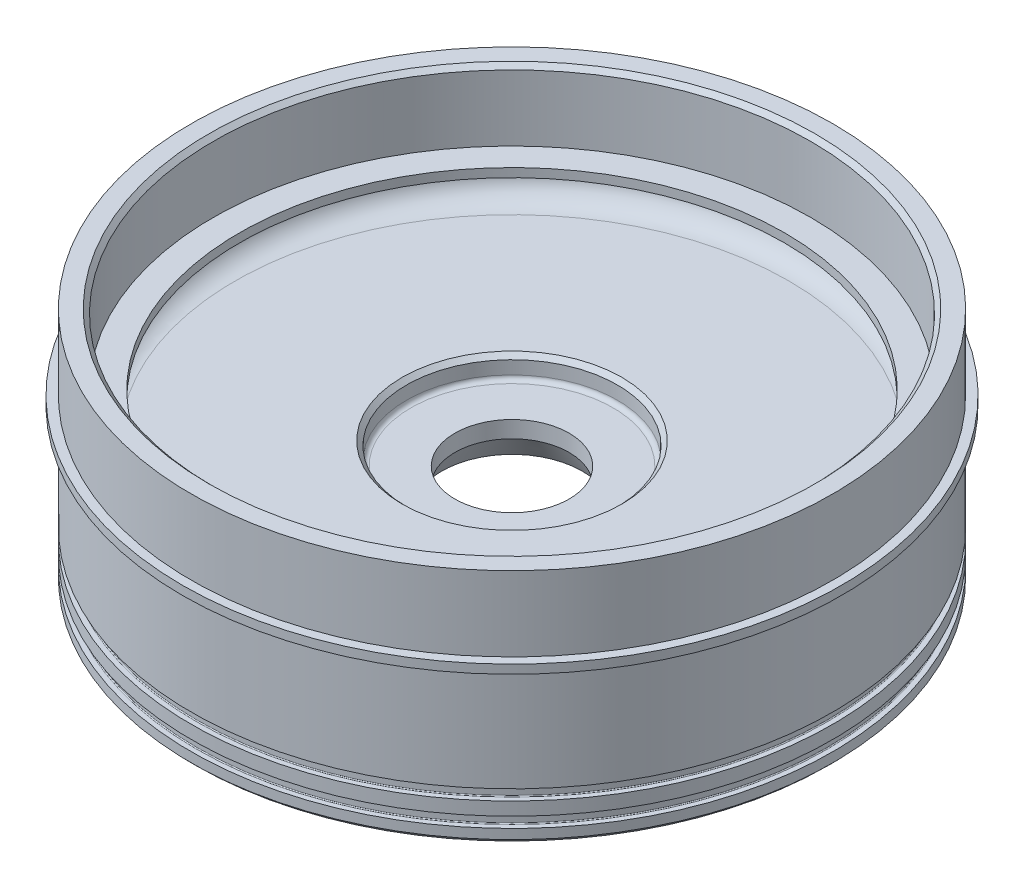
ISO-10303-21;
HEADER;
FILE_DESCRIPTION(('STEP AP214'),'2;1');
FILE_NAME('part.step','',(''),(''),'','','');
FILE_SCHEMA(('AUTOMOTIVE_DESIGN { 1 0 10303 214 1 1 1 1 }'));
ENDSEC;
DATA;
#1=APPLICATION_CONTEXT('core data for automotive mechanical design processes');
#2=APPLICATION_PROTOCOL_DEFINITION('international standard','automotive_design',2000,#1);
#3=PRODUCT_CONTEXT('',#1,'mechanical');
#4=PRODUCT('Part','Part','',(#3));
#5=PRODUCT_RELATED_PRODUCT_CATEGORY('part','',(#4));
#6=PRODUCT_DEFINITION_FORMATION('','',#4);
#7=PRODUCT_DEFINITION_CONTEXT('part definition',#1,'design');
#8=PRODUCT_DEFINITION('design','',#6,#7);
#9=PRODUCT_DEFINITION_SHAPE('','',#8);
#10=(LENGTH_UNIT() NAMED_UNIT(*) SI_UNIT(.MILLI.,.METRE.));
#11=(NAMED_UNIT(*) PLANE_ANGLE_UNIT() SI_UNIT($,.RADIAN.));
#12=(NAMED_UNIT(*) SI_UNIT($,.STERADIAN.) SOLID_ANGLE_UNIT());
#13=UNCERTAINTY_MEASURE_WITH_UNIT(LENGTH_MEASURE(1.E-05),#10,'distance_accuracy_value','');
#14=(GEOMETRIC_REPRESENTATION_CONTEXT(3) GLOBAL_UNCERTAINTY_ASSIGNED_CONTEXT((#13)) GLOBAL_UNIT_ASSIGNED_CONTEXT((#10,
#11,#12)) REPRESENTATION_CONTEXT('',''));
#15=CARTESIAN_POINT('',(0.,0.,0.));
#16=DIRECTION('',(0.,0.,1.));
#17=DIRECTION('',(1.,0.,0.));
#18=AXIS2_PLACEMENT_3D('',#15,#16,#17);
#19=CARTESIAN_POINT('',(0.,0.,0.));
#20=DIRECTION('',(0.,-1.,0.));
#21=DIRECTION('',(0.,0.,-1.));
#22=AXIS2_PLACEMENT_3D('',#19,#20,#21);
#23=CYLINDRICAL_SURFACE('',#22,13.);
#24=CARTESIAN_POINT('',(0.,5.19615242270666,0.));
#25=DIRECTION('',(0.,-1.,0.));
#26=DIRECTION('',(0.,0.,-1.));
#27=AXIS2_PLACEMENT_3D('',#24,#25,#26);
#28=CIRCLE('',#27,13.);
#29=CARTESIAN_POINT('',(0.,5.19615242270666,-13.));
#30=VERTEX_POINT('',#29);
#31=EDGE_CURVE('E112',#30,#30,#28,.T.);
#32=ORIENTED_EDGE('',*,*,#31,.T.);
#33=EDGE_LOOP('',(#32));
#34=FACE_BOUND('',#33,.T.);
#35=CARTESIAN_POINT('',(0.,8.99999999999999,0.));
#36=DIRECTION('',(0.,-1.,0.));
#37=DIRECTION('',(0.,0.,-1.));
#38=AXIS2_PLACEMENT_3D('',#35,#36,#37);
#39=CIRCLE('',#38,13.);
#40=CARTESIAN_POINT('',(0.,8.99999999999999,-13.));
#41=VERTEX_POINT('',#40);
#42=EDGE_CURVE('E154',#41,#41,#39,.T.);
#43=ORIENTED_EDGE('',*,*,#42,.F.);
#44=EDGE_LOOP('',(#43));
#45=FACE_BOUND('',#44,.T.);
#46=ADVANCED_FACE('F37',(#34,#45),#23,.F.);
#47=CARTESIAN_POINT('',(0.,14.,0.));
#48=DIRECTION('',(0.,1.,0.));
#49=DIRECTION('',(0.,0.,1.));
#50=AXIS2_PLACEMENT_3D('',#47,#48,#49);
#51=PLANE('',#50);
#52=CARTESIAN_POINT('',(0.,14.,0.));
#53=DIRECTION('',(0.,1.,0.));
#54=DIRECTION('',(0.,0.,1.));
#55=AXIS2_PLACEMENT_3D('',#52,#53,#54);
#56=CIRCLE('',#55,63.);
#57=CARTESIAN_POINT('',(0.,14.,63.));
#58=VERTEX_POINT('',#57);
#59=EDGE_CURVE('E49',#58,#58,#56,.T.);
#60=ORIENTED_EDGE('',*,*,#59,.T.);
#61=EDGE_LOOP('',(#60));
#62=FACE_BOUND('',#61,.T.);
#63=CARTESIAN_POINT('',(0.,14.,0.));
#64=DIRECTION('',(0.,1.,0.));
#65=DIRECTION('',(0.,0.,1.));
#66=AXIS2_PLACEMENT_3D('',#63,#64,#65);
#67=CIRCLE('',#66,25.);
#68=CARTESIAN_POINT('',(0.,14.,25.));
#69=VERTEX_POINT('',#68);
#70=EDGE_CURVE('E61',#69,#69,#67,.F.);
#71=ORIENTED_EDGE('',*,*,#70,.T.);
#72=EDGE_LOOP('',(#71));
#73=FACE_BOUND('',#72,.T.);
#74=ADVANCED_FACE('F161',(#62,#73),#51,.T.);
#75=CARTESIAN_POINT('',(0.,0.,0.));
#76=DIRECTION('',(0.,-1.,0.));
#77=DIRECTION('',(0.,0.,-1.));
#78=AXIS2_PLACEMENT_3D('',#75,#76,#77);
#79=CYLINDRICAL_SURFACE('',#78,68.);
#80=CARTESIAN_POINT('',(0.,19.,0.));
#81=DIRECTION('',(0.,1.,0.));
#82=DIRECTION('',(0.,0.,1.));
#83=AXIS2_PLACEMENT_3D('',#80,#81,#82);
#84=CIRCLE('',#83,68.);
#85=CARTESIAN_POINT('',(0.,19.,68.));
#86=VERTEX_POINT('',#85);
#87=EDGE_CURVE('E53',#86,#86,#84,.F.);
#88=ORIENTED_EDGE('',*,*,#87,.T.);
#89=EDGE_LOOP('',(#88));
#90=FACE_BOUND('',#89,.T.);
#91=CARTESIAN_POINT('',(0.,22.,0.));
#92=DIRECTION('',(0.,-1.,0.));
#93=DIRECTION('',(0.,0.,-1.));
#94=AXIS2_PLACEMENT_3D('',#91,#92,#93);
#95=CIRCLE('',#94,68.);
#96=CARTESIAN_POINT('',(0.,22.,-68.));
#97=VERTEX_POINT('',#96);
#98=EDGE_CURVE('E115',#97,#97,#95,.T.);
#99=ORIENTED_EDGE('',*,*,#98,.F.);
#100=EDGE_LOOP('',(#99));
#101=FACE_BOUND('',#100,.T.);
#102=ADVANCED_FACE('F167',(#90,#101),#79,.F.);
#103=CARTESIAN_POINT('',(0.,22.,0.));
#104=DIRECTION('',(0.,-1.,0.));
#105=DIRECTION('',(0.,0.,-1.));
#106=AXIS2_PLACEMENT_3D('',#103,#104,#105);
#107=PLANE('',#106);
#108=ORIENTED_EDGE('',*,*,#98,.T.);
#109=EDGE_LOOP('',(#108));
#110=FACE_BOUND('',#109,.T.);
#111=CARTESIAN_POINT('',(0.,22.,0.));
#112=DIRECTION('',(0.,-1.,0.));
#113=DIRECTION('',(0.,0.,-1.));
#114=AXIS2_PLACEMENT_3D('',#111,#112,#113);
#115=CIRCLE('',#114,62.);
#116=CARTESIAN_POINT('',(0.,22.,-62.));
#117=VERTEX_POINT('',#116);
#118=EDGE_CURVE('E118',#117,#117,#115,.T.);
#119=ORIENTED_EDGE('',*,*,#118,.F.);
#120=EDGE_LOOP('',(#119));
#121=FACE_BOUND('',#120,.T.);
#122=ADVANCED_FACE('F238',(#110,#121),#107,.T.);
#123=CARTESIAN_POINT('',(0.,0.,0.));
#124=DIRECTION('',(0.,-1.,0.));
#125=DIRECTION('',(0.,0.,-1.));
#126=AXIS2_PLACEMENT_3D('',#123,#124,#125);
#127=CYLINDRICAL_SURFACE('',#126,62.);
#128=ORIENTED_EDGE('',*,*,#118,.T.);
#129=EDGE_LOOP('',(#128));
#130=FACE_BOUND('',#129,.T.);
#131=CARTESIAN_POINT('',(0.,24.,0.));
#132=DIRECTION('',(0.,-1.,0.));
#133=DIRECTION('',(0.,0.,-1.));
#134=AXIS2_PLACEMENT_3D('',#131,#132,#133);
#135=CIRCLE('',#134,62.);
#136=CARTESIAN_POINT('',(0.,24.,-62.));
#137=VERTEX_POINT('',#136);
#138=EDGE_CURVE('E121',#137,#137,#135,.T.);
#139=ORIENTED_EDGE('',*,*,#138,.F.);
#140=EDGE_LOOP('',(#139));
#141=FACE_BOUND('',#140,.T.);
#142=ADVANCED_FACE('F245',(#130,#141),#127,.F.);
#143=CARTESIAN_POINT('',(0.,24.,0.));
#144=DIRECTION('',(0.,1.,0.));
#145=DIRECTION('',(0.,0.,1.));
#146=AXIS2_PLACEMENT_3D('',#143,#144,#145);
#147=PLANE('',#146);
#148=ORIENTED_EDGE('',*,*,#138,.T.);
#149=EDGE_LOOP('',(#148));
#150=FACE_BOUND('',#149,.T.);
#151=CARTESIAN_POINT('',(0.,24.,0.));
#152=DIRECTION('',(0.,-1.,0.));
#153=DIRECTION('',(0.,0.,-1.));
#154=AXIS2_PLACEMENT_3D('',#151,#152,#153);
#155=CIRCLE('',#154,68.);
#156=CARTESIAN_POINT('',(0.,24.,-68.));
#157=VERTEX_POINT('',#156);
#158=EDGE_CURVE('E124',#157,#157,#155,.T.);
#159=ORIENTED_EDGE('',*,*,#158,.F.);
#160=EDGE_LOOP('',(#159));
#161=FACE_BOUND('',#160,.T.);
#162=ADVANCED_FACE('F250',(#150,#161),#147,.T.);
#163=CARTESIAN_POINT('',(0.,39.,0.));
#164=DIRECTION('',(0.,1.,0.));
#165=DIRECTION('',(0.,0.,1.));
#166=AXIS2_PLACEMENT_3D('',#163,#164,#165);
#167=CIRCLE('',#166,68.);
#168=CARTESIAN_POINT('',(0.,39.,68.));
#169=VERTEX_POINT('',#168);
#170=EDGE_CURVE('E94',#169,#169,#167,.T.);
#171=ORIENTED_EDGE('',*,*,#170,.T.);
#172=EDGE_LOOP('',(#171));
#173=FACE_BOUND('',#172,.T.);
#174=ORIENTED_EDGE('',*,*,#158,.T.);
#175=EDGE_LOOP('',(#174));
#176=FACE_BOUND('',#175,.T.);
#177=ADVANCED_FACE('F240',(#173,#176),#79,.F.);
#178=CARTESIAN_POINT('',(0.,40.,0.));
#179=DIRECTION('',(0.,1.,0.));
#180=DIRECTION('',(0.,0.,1.));
#181=AXIS2_PLACEMENT_3D('',#178,#179,#180);
#182=PLANE('',#181);
#183=CARTESIAN_POINT('',(0.,40.,0.));
#184=DIRECTION('',(0.,1.,0.));
#185=DIRECTION('',(0.,0.,1.));
#186=AXIS2_PLACEMENT_3D('',#183,#184,#185);
#187=CIRCLE('',#186,69.);
#188=CARTESIAN_POINT('',(0.,40.,69.));
#189=VERTEX_POINT('',#188);
#190=EDGE_CURVE('E97',#189,#189,#187,.F.);
#191=ORIENTED_EDGE('',*,*,#190,.T.);
#192=EDGE_LOOP('',(#191));
#193=FACE_BOUND('',#192,.T.);
#194=CARTESIAN_POINT('',(0.,40.,0.));
#195=DIRECTION('',(0.,-1.,0.));
#196=DIRECTION('',(0.,0.,-1.));
#197=AXIS2_PLACEMENT_3D('',#194,#195,#196);
#198=CIRCLE('',#197,73.);
#199=CARTESIAN_POINT('',(0.,40.,-73.));
#200=VERTEX_POINT('',#199);
#201=EDGE_CURVE('E127',#200,#200,#198,.T.);
#202=ORIENTED_EDGE('',*,*,#201,.F.);
#203=EDGE_LOOP('',(#202));
#204=FACE_BOUND('',#203,.T.);
#205=ADVANCED_FACE('F260',(#193,#204),#182,.T.);
#206=CARTESIAN_POINT('',(0.,0.,0.));
#207=DIRECTION('',(0.,-1.,0.));
#208=DIRECTION('',(0.,0.,-1.));
#209=AXIS2_PLACEMENT_3D('',#206,#207,#208);
#210=CYLINDRICAL_SURFACE('',#209,73.);
#211=ORIENTED_EDGE('',*,*,#201,.T.);
#212=EDGE_LOOP('',(#211));
#213=FACE_BOUND('',#212,.T.);
#214=CARTESIAN_POINT('',(0.,23.,0.));
#215=DIRECTION('',(0.,-1.,0.));
#216=DIRECTION('',(0.,0.,-1.));
#217=AXIS2_PLACEMENT_3D('',#214,#215,#216);
#218=CIRCLE('',#217,73.);
#219=CARTESIAN_POINT('',(0.,23.,-73.));
#220=VERTEX_POINT('',#219);
#221=EDGE_CURVE('E130',#220,#220,#218,.T.);
#222=ORIENTED_EDGE('',*,*,#221,.F.);
#223=EDGE_LOOP('',(#222));
#224=FACE_BOUND('',#223,.T.);
#225=ADVANCED_FACE('F265',(#213,#224),#210,.T.);
#226=CARTESIAN_POINT('',(0.,23.,0.));
#227=DIRECTION('',(0.,-1.,0.));
#228=DIRECTION('',(0.,0.,-1.));
#229=AXIS2_PLACEMENT_3D('',#226,#227,#228);
#230=PLANE('',#229);
#231=CARTESIAN_POINT('',(0.,23.,0.));
#232=DIRECTION('',(0.,-1.,0.));
#233=DIRECTION('',(0.,0.,-1.));
#234=AXIS2_PLACEMENT_3D('',#231,#232,#233);
#235=CIRCLE('',#234,75.);
#236=CARTESIAN_POINT('',(0.,23.,-75.));
#237=VERTEX_POINT('',#236);
#238=EDGE_CURVE('E133',#237,#237,#235,.T.);
#239=ORIENTED_EDGE('',*,*,#238,.F.);
#240=EDGE_LOOP('',(#239));
#241=FACE_BOUND('',#240,.T.);
#242=ORIENTED_EDGE('',*,*,#221,.T.);
#243=EDGE_LOOP('',(#242));
#244=FACE_BOUND('',#243,.T.);
#245=ADVANCED_FACE('F271',(#241,#244),#230,.F.);
#246=CARTESIAN_POINT('',(0.,0.,0.));
#247=DIRECTION('',(0.,-1.,0.));
#248=DIRECTION('',(0.,0.,-1.));
#249=AXIS2_PLACEMENT_3D('',#246,#247,#248);
#250=CYLINDRICAL_SURFACE('',#249,75.);
#251=CARTESIAN_POINT('',(0.,21.,0.));
#252=DIRECTION('',(0.,-1.,0.));
#253=DIRECTION('',(0.,0.,-1.));
#254=AXIS2_PLACEMENT_3D('',#251,#252,#253);
#255=CIRCLE('',#254,75.);
#256=CARTESIAN_POINT('',(0.,21.,-75.));
#257=VERTEX_POINT('',#256);
#258=EDGE_CURVE('E136',#257,#257,#255,.T.);
#259=ORIENTED_EDGE('',*,*,#258,.F.);
#260=EDGE_LOOP('',(#259));
#261=FACE_BOUND('',#260,.T.);
#262=ORIENTED_EDGE('',*,*,#238,.T.);
#263=EDGE_LOOP('',(#262));
#264=FACE_BOUND('',#263,.T.);
#265=ADVANCED_FACE('F275',(#261,#264),#250,.T.);
#266=CARTESIAN_POINT('',(0.,21.,0.));
#267=DIRECTION('',(0.,1.,0.));
#268=DIRECTION('',(0.,0.,1.));
#269=AXIS2_PLACEMENT_3D('',#266,#267,#268);
#270=PLANE('',#269);
#271=CARTESIAN_POINT('',(0.,21.,0.));
#272=DIRECTION('',(0.,-1.,0.));
#273=DIRECTION('',(0.,0.,-1.));
#274=AXIS2_PLACEMENT_3D('',#271,#272,#273);
#275=CIRCLE('',#274,73.);
#276=CARTESIAN_POINT('',(0.,21.,-73.));
#277=VERTEX_POINT('',#276);
#278=EDGE_CURVE('E139',#277,#277,#275,.T.);
#279=ORIENTED_EDGE('',*,*,#278,.F.);
#280=EDGE_LOOP('',(#279));
#281=FACE_BOUND('',#280,.T.);
#282=ORIENTED_EDGE('',*,*,#258,.T.);
#283=EDGE_LOOP('',(#282));
#284=FACE_BOUND('',#283,.T.);
#285=ADVANCED_FACE('F279',(#281,#284),#270,.F.);
#286=CARTESIAN_POINT('',(0.,0.,0.));
#287=DIRECTION('',(0.,-1.,0.));
#288=DIRECTION('',(0.,0.,-1.));
#289=AXIS2_PLACEMENT_3D('',#286,#287,#288);
#290=CYLINDRICAL_SURFACE('',#289,73.);
#291=ORIENTED_EDGE('',*,*,#278,.T.);
#292=EDGE_LOOP('',(#291));
#293=FACE_BOUND('',#292,.T.);
#294=CARTESIAN_POINT('',(0.,-3.,0.));
#295=DIRECTION('',(0.,-1.,0.));
#296=DIRECTION('',(0.,0.,-1.));
#297=AXIS2_PLACEMENT_3D('',#294,#295,#296);
#298=CIRCLE('',#297,73.);
#299=CARTESIAN_POINT('',(0.,-3.,-73.));
#300=VERTEX_POINT('',#299);
#301=EDGE_CURVE('E142',#300,#300,#298,.T.);
#302=ORIENTED_EDGE('',*,*,#301,.F.);
#303=EDGE_LOOP('',(#302));
#304=FACE_BOUND('',#303,.T.);
#305=ADVANCED_FACE('F283',(#293,#304),#290,.T.);
#306=CARTESIAN_POINT('',(0.,-3.,0.));
#307=DIRECTION('',(0.,1.,0.));
#308=DIRECTION('',(0.,0.,1.));
#309=AXIS2_PLACEMENT_3D('',#306,#307,#308);
#310=PLANE('',#309);
#311=CARTESIAN_POINT('',(0.,-3.,0.));
#312=DIRECTION('',(0.,1.,0.));
#313=DIRECTION('',(0.,0.,1.));
#314=AXIS2_PLACEMENT_3D('',#311,#312,#313);
#315=CIRCLE('',#314,71.9);
#316=CARTESIAN_POINT('',(0.,-3.,71.9));
#317=VERTEX_POINT('',#316);
#318=EDGE_CURVE('E73',#317,#317,#315,.T.);
#319=ORIENTED_EDGE('',*,*,#318,.T.);
#320=EDGE_LOOP('',(#319));
#321=FACE_BOUND('',#320,.T.);
#322=ORIENTED_EDGE('',*,*,#301,.T.);
#323=EDGE_LOOP('',(#322));
#324=FACE_BOUND('',#323,.T.);
#325=ADVANCED_FACE('F287',(#321,#324),#310,.F.);
#326=CARTESIAN_POINT('',(0.,0.,0.));
#327=DIRECTION('',(0.,-1.,0.));
#328=DIRECTION('',(0.,0.,-1.));
#329=AXIS2_PLACEMENT_3D('',#326,#327,#328);
#330=CYLINDRICAL_SURFACE('',#329,71.7);
#331=CARTESIAN_POINT('',(0.,-3.2,0.));
#332=DIRECTION('',(0.,1.,0.));
#333=DIRECTION('',(0.,0.,1.));
#334=AXIS2_PLACEMENT_3D('',#331,#332,#333);
#335=CIRCLE('',#334,71.7);
#336=CARTESIAN_POINT('',(0.,-3.2,71.7));
#337=VERTEX_POINT('',#336);
#338=EDGE_CURVE('E76',#337,#337,#335,.F.);
#339=ORIENTED_EDGE('',*,*,#338,.T.);
#340=EDGE_LOOP('',(#339));
#341=FACE_BOUND('',#340,.T.);
#342=CARTESIAN_POINT('',(0.,-5.2,0.));
#343=DIRECTION('',(0.,-1.,0.));
#344=DIRECTION('',(0.,0.,-1.));
#345=AXIS2_PLACEMENT_3D('',#342,#343,#344);
#346=CIRCLE('',#345,71.7);
#347=CARTESIAN_POINT('',(0.,-5.2,-71.7));
#348=VERTEX_POINT('',#347);
#349=EDGE_CURVE('E79',#348,#348,#346,.F.);
#350=ORIENTED_EDGE('',*,*,#349,.T.);
#351=EDGE_LOOP('',(#350));
#352=FACE_BOUND('',#351,.T.);
#353=ADVANCED_FACE('F291',(#341,#352),#330,.T.);
#354=CARTESIAN_POINT('',(0.,-5.4,0.));
#355=DIRECTION('',(0.,-1.,0.));
#356=DIRECTION('',(0.,0.,-1.));
#357=AXIS2_PLACEMENT_3D('',#354,#355,#356);
#358=PLANE('',#357);
#359=CARTESIAN_POINT('',(0.,-5.4,0.));
#360=DIRECTION('',(0.,-1.,0.));
#361=DIRECTION('',(0.,0.,-1.));
#362=AXIS2_PLACEMENT_3D('',#359,#360,#361);
#363=CIRCLE('',#362,71.9);
#364=CARTESIAN_POINT('',(0.,-5.4,-71.9));
#365=VERTEX_POINT('',#364);
#366=EDGE_CURVE('E70',#365,#365,#363,.T.);
#367=ORIENTED_EDGE('',*,*,#366,.T.);
#368=EDGE_LOOP('',(#367));
#369=FACE_BOUND('',#368,.T.);
#370=CARTESIAN_POINT('',(0.,-5.4,0.));
#371=DIRECTION('',(0.,-1.,0.));
#372=DIRECTION('',(0.,0.,-1.));
#373=AXIS2_PLACEMENT_3D('',#370,#371,#372);
#374=CIRCLE('',#373,73.);
#375=CARTESIAN_POINT('',(0.,-5.4,-73.));
#376=VERTEX_POINT('',#375);
#377=EDGE_CURVE('E145',#376,#376,#374,.T.);
#378=ORIENTED_EDGE('',*,*,#377,.F.);
#379=EDGE_LOOP('',(#378));
#380=FACE_BOUND('',#379,.T.);
#381=ADVANCED_FACE('F295',(#369,#380),#358,.F.);
#382=CARTESIAN_POINT('',(0.,0.,0.));
#383=DIRECTION('',(0.,-1.,0.));
#384=DIRECTION('',(0.,0.,-1.));
#385=AXIS2_PLACEMENT_3D('',#382,#383,#384);
#386=CYLINDRICAL_SURFACE('',#385,73.);
#387=ORIENTED_EDGE('',*,*,#377,.T.);
#388=EDGE_LOOP('',(#387));
#389=FACE_BOUND('',#388,.T.);
#390=CARTESIAN_POINT('',(0.,-8.4,0.));
#391=DIRECTION('',(0.,-1.,0.));
#392=DIRECTION('',(0.,0.,-1.));
#393=AXIS2_PLACEMENT_3D('',#390,#391,#392);
#394=CIRCLE('',#393,73.);
#395=CARTESIAN_POINT('',(0.,-8.4,-73.));
#396=VERTEX_POINT('',#395);
#397=EDGE_CURVE('E148',#396,#396,#394,.T.);
#398=ORIENTED_EDGE('',*,*,#397,.F.);
#399=EDGE_LOOP('',(#398));
#400=FACE_BOUND('',#399,.T.);
#401=ADVANCED_FACE('F299',(#389,#400),#386,.T.);
#402=CARTESIAN_POINT('',(0.,-8.4,0.));
#403=DIRECTION('',(0.,1.,0.));
#404=DIRECTION('',(0.,0.,1.));
#405=AXIS2_PLACEMENT_3D('',#402,#403,#404);
#406=PLANE('',#405);
#407=CARTESIAN_POINT('',(0.,-8.4,0.));
#408=DIRECTION('',(0.,1.,0.));
#409=DIRECTION('',(0.,0.,1.));
#410=AXIS2_PLACEMENT_3D('',#407,#408,#409);
#411=CIRCLE('',#410,71.9);
#412=CARTESIAN_POINT('',(0.,-8.4,71.9));
#413=VERTEX_POINT('',#412);
#414=EDGE_CURVE('E85',#413,#413,#411,.T.);
#415=ORIENTED_EDGE('',*,*,#414,.T.);
#416=EDGE_LOOP('',(#415));
#417=FACE_BOUND('',#416,.T.);
#418=ORIENTED_EDGE('',*,*,#397,.T.);
#419=EDGE_LOOP('',(#418));
#420=FACE_BOUND('',#419,.T.);
#421=ADVANCED_FACE('F301',(#417,#420),#406,.F.);
#422=CARTESIAN_POINT('',(0.,0.,0.));
#423=DIRECTION('',(0.,-1.,0.));
#424=DIRECTION('',(0.,0.,-1.));
#425=AXIS2_PLACEMENT_3D('',#422,#423,#424);
#426=CYLINDRICAL_SURFACE('',#425,71.7);
#427=CARTESIAN_POINT('',(0.,-8.6,0.));
#428=DIRECTION('',(0.,1.,0.));
#429=DIRECTION('',(0.,0.,1.));
#430=AXIS2_PLACEMENT_3D('',#427,#428,#429);
#431=CIRCLE('',#430,71.7);
#432=CARTESIAN_POINT('',(0.,-8.6,71.7));
#433=VERTEX_POINT('',#432);
#434=EDGE_CURVE('E88',#433,#433,#431,.F.);
#435=ORIENTED_EDGE('',*,*,#434,.T.);
#436=EDGE_LOOP('',(#435));
#437=FACE_BOUND('',#436,.T.);
#438=CARTESIAN_POINT('',(0.,-10.6,0.));
#439=DIRECTION('',(0.,-1.,0.));
#440=DIRECTION('',(0.,0.,-1.));
#441=AXIS2_PLACEMENT_3D('',#438,#439,#440);
#442=CIRCLE('',#441,71.7);
#443=CARTESIAN_POINT('',(0.,-10.6,-71.7));
#444=VERTEX_POINT('',#443);
#445=EDGE_CURVE('E91',#444,#444,#442,.F.);
#446=ORIENTED_EDGE('',*,*,#445,.T.);
#447=EDGE_LOOP('',(#446));
#448=FACE_BOUND('',#447,.T.);
#449=ADVANCED_FACE('F304',(#437,#448),#426,.T.);
#450=CARTESIAN_POINT('',(0.,-10.8,0.));
#451=DIRECTION('',(0.,-1.,0.));
#452=DIRECTION('',(0.,0.,-1.));
#453=AXIS2_PLACEMENT_3D('',#450,#451,#452);
#454=PLANE('',#453);
#455=CARTESIAN_POINT('',(0.,-10.8,0.));
#456=DIRECTION('',(0.,-1.,0.));
#457=DIRECTION('',(0.,0.,-1.));
#458=AXIS2_PLACEMENT_3D('',#455,#456,#457);
#459=CIRCLE('',#458,71.9);
#460=CARTESIAN_POINT('',(0.,-10.8,-71.9));
#461=VERTEX_POINT('',#460);
#462=EDGE_CURVE('E82',#461,#461,#459,.T.);
#463=ORIENTED_EDGE('',*,*,#462,.T.);
#464=EDGE_LOOP('',(#463));
#465=FACE_BOUND('',#464,.T.);
#466=CARTESIAN_POINT('',(0.,-10.8,0.));
#467=DIRECTION('',(0.,-1.,0.));
#468=DIRECTION('',(0.,0.,-1.));
#469=AXIS2_PLACEMENT_3D('',#466,#467,#468);
#470=CIRCLE('',#469,73.);
#471=CARTESIAN_POINT('',(0.,-10.8,-73.));
#472=VERTEX_POINT('',#471);
#473=EDGE_CURVE('E151',#472,#472,#470,.T.);
#474=ORIENTED_EDGE('',*,*,#473,.F.);
#475=EDGE_LOOP('',(#474));
#476=FACE_BOUND('',#475,.T.);
#477=ADVANCED_FACE('F308',(#465,#476),#454,.F.);
#478=CARTESIAN_POINT('',(0.,-13.,0.));
#479=DIRECTION('',(0.,-1.,0.));
#480=DIRECTION('',(0.,0.,-1.));
#481=AXIS2_PLACEMENT_3D('',#478,#479,#480);
#482=CIRCLE('',#481,73.);
#483=CARTESIAN_POINT('',(0.,-13.,-73.));
#484=VERTEX_POINT('',#483);
#485=EDGE_CURVE('E10',#484,#484,#482,.F.);
#486=ORIENTED_EDGE('',*,*,#485,.T.);
#487=EDGE_LOOP('',(#486));
#488=FACE_BOUND('',#487,.T.);
#489=ORIENTED_EDGE('',*,*,#473,.T.);
#490=EDGE_LOOP('',(#489));
#491=FACE_BOUND('',#490,.T.);
#492=ADVANCED_FACE('F312',(#488,#491),#386,.T.);
#493=CARTESIAN_POINT('',(0.,-14.,0.));
#494=DIRECTION('',(0.,-1.,0.));
#495=DIRECTION('',(0.,0.,-1.));
#496=AXIS2_PLACEMENT_3D('',#493,#494,#495);
#497=PLANE('',#496);
#498=CARTESIAN_POINT('',(0.,-14.,0.));
#499=DIRECTION('',(0.,-1.,0.));
#500=DIRECTION('',(0.,0.,-1.));
#501=AXIS2_PLACEMENT_3D('',#498,#499,#500);
#502=CIRCLE('',#501,72.);
#503=CARTESIAN_POINT('',(0.,-14.,-72.));
#504=VERTEX_POINT('',#503);
#505=EDGE_CURVE('E45',#504,#504,#502,.T.);
#506=ORIENTED_EDGE('',*,*,#505,.T.);
#507=EDGE_LOOP('',(#506));
#508=FACE_BOUND('',#507,.T.);
#509=CARTESIAN_POINT('',(0.,-14.,0.));
#510=DIRECTION('',(0.,-1.,0.));
#511=DIRECTION('',(0.,0.,-1.));
#512=AXIS2_PLACEMENT_3D('',#509,#510,#511);
#513=CIRCLE('',#512,70.);
#514=CARTESIAN_POINT('',(0.,-14.,-70.));
#515=VERTEX_POINT('',#514);
#516=EDGE_CURVE('E103',#515,#515,#513,.F.);
#517=ORIENTED_EDGE('',*,*,#516,.T.);
#518=EDGE_LOOP('',(#517));
#519=FACE_BOUND('',#518,.T.);
#520=ADVANCED_FACE('F316',(#508,#519),#497,.T.);
#521=CARTESIAN_POINT('',(0.,0.,0.));
#522=DIRECTION('',(0.,-1.,0.));
#523=DIRECTION('',(0.,0.,-1.));
#524=AXIS2_PLACEMENT_3D('',#521,#522,#523);
#525=PLANE('',#524);
#526=CARTESIAN_POINT('',(0.,0.,0.));
#527=DIRECTION('',(0.,-1.,0.));
#528=DIRECTION('',(0.,0.,-1.));
#529=AXIS2_PLACEMENT_3D('',#526,#527,#528);
#530=CIRCLE('',#529,46.4833395016046);
#531=CARTESIAN_POINT('',(0.,0.,-46.4833395016046));
#532=VERTEX_POINT('',#531);
#533=EDGE_CURVE('E100',#532,#532,#530,.T.);
#534=ORIENTED_EDGE('',*,*,#533,.T.);
#535=EDGE_LOOP('',(#534));
#536=FACE_BOUND('',#535,.T.);
#537=CARTESIAN_POINT('',(0.,0.,0.));
#538=DIRECTION('',(0.,-1.,0.));
#539=DIRECTION('',(0.,0.,-1.));
#540=AXIS2_PLACEMENT_3D('',#537,#538,#539);
#541=CIRCLE('',#540,16.);
#542=CARTESIAN_POINT('',(0.,0.,-16.));
#543=VERTEX_POINT('',#542);
#544=EDGE_CURVE('E109',#543,#543,#541,.F.);
#545=ORIENTED_EDGE('',*,*,#544,.T.);
#546=EDGE_LOOP('',(#545));
#547=FACE_BOUND('',#546,.T.);
#548=ADVANCED_FACE('F180',(#536,#547),#525,.T.);
#549=CARTESIAN_POINT('',(0.,5.19615242270666,0.));
#550=DIRECTION('',(0.,-1.,0.));
#551=DIRECTION('',(0.,0.,-1.));
#552=AXIS2_PLACEMENT_3D('',#549,#550,#551);
#553=CONICAL_SURFACE('',#552,13.,0.5235987755983);
#554=ORIENTED_EDGE('',*,*,#544,.F.);
#555=EDGE_LOOP('',(#554));
#556=FACE_BOUND('',#555,.T.);
#557=ORIENTED_EDGE('',*,*,#31,.F.);
#558=EDGE_LOOP('',(#557));
#559=FACE_BOUND('',#558,.T.);
#560=ADVANCED_FACE('F173',(#556,#559),#553,.F.);
#561=CARTESIAN_POINT('',(0.,-13.,0.));
#562=DIRECTION('',(0.,-1.,0.));
#563=DIRECTION('',(0.,0.,-1.));
#564=AXIS2_PLACEMENT_3D('',#561,#562,#563);
#565=CONICAL_SURFACE('',#564,69.,0.785398163397434);
#566=ORIENTED_EDGE('',*,*,#516,.F.);
#567=EDGE_LOOP('',(#566));
#568=FACE_BOUND('',#567,.T.);
#569=CARTESIAN_POINT('',(0.,-13.,0.));
#570=DIRECTION('',(0.,-1.,0.));
#571=DIRECTION('',(0.,0.,-1.));
#572=AXIS2_PLACEMENT_3D('',#569,#570,#571);
#573=CIRCLE('',#572,69.);
#574=CARTESIAN_POINT('',(0.,-13.,-69.));
#575=VERTEX_POINT('',#574);
#576=EDGE_CURVE('E106',#575,#575,#573,.T.);
#577=ORIENTED_EDGE('',*,*,#576,.F.);
#578=EDGE_LOOP('',(#577));
#579=FACE_BOUND('',#578,.T.);
#580=ADVANCED_FACE('F179',(#568,#579),#565,.F.);
#581=CARTESIAN_POINT('',(0.,-26.,0.));
#582=DIRECTION('',(0.,1.,0.));
#583=DIRECTION('',(0.,0.,1.));
#584=AXIS2_PLACEMENT_3D('',#581,#582,#583);
#585=TOROIDAL_SURFACE('',#584,46.4833395016046,26.);
#586=ORIENTED_EDGE('',*,*,#576,.T.);
#587=EDGE_LOOP('',(#586));
#588=FACE_BOUND('',#587,.T.);
#589=ORIENTED_EDGE('',*,*,#533,.F.);
#590=EDGE_LOOP('',(#589));
#591=FACE_BOUND('',#590,.T.);
#592=ADVANCED_FACE('F187',(#588,#591),#585,.F.);
#593=CARTESIAN_POINT('',(0.,40.,0.));
#594=DIRECTION('',(0.,1.,0.));
#595=DIRECTION('',(0.,0.,1.));
#596=AXIS2_PLACEMENT_3D('',#593,#594,#595);
#597=CONICAL_SURFACE('',#596,69.,0.785398163397462);
#598=ORIENTED_EDGE('',*,*,#170,.F.);
#599=EDGE_LOOP('',(#598));
#600=FACE_BOUND('',#599,.T.);
#601=ORIENTED_EDGE('',*,*,#190,.F.);
#602=EDGE_LOOP('',(#601));
#603=FACE_BOUND('',#602,.T.);
#604=ADVANCED_FACE('F191',(#600,#603),#597,.F.);
#605=CARTESIAN_POINT('',(0.,-8.6,0.));
#606=DIRECTION('',(0.,1.,0.));
#607=DIRECTION('',(0.,0.,1.));
#608=AXIS2_PLACEMENT_3D('',#605,#606,#607);
#609=TOROIDAL_SURFACE('',#608,71.9,0.2);
#610=ORIENTED_EDGE('',*,*,#414,.F.);
#611=EDGE_LOOP('',(#610));
#612=FACE_BOUND('',#611,.T.);
#613=ORIENTED_EDGE('',*,*,#434,.F.);
#614=EDGE_LOOP('',(#613));
#615=FACE_BOUND('',#614,.T.);
#616=ADVANCED_FACE('F198',(#612,#615),#609,.F.);
#617=CARTESIAN_POINT('',(0.,-10.6,0.));
#618=DIRECTION('',(0.,-1.,0.));
#619=DIRECTION('',(0.,0.,-1.));
#620=AXIS2_PLACEMENT_3D('',#617,#618,#619);
#621=TOROIDAL_SURFACE('',#620,71.9,0.2);
#622=ORIENTED_EDGE('',*,*,#445,.F.);
#623=EDGE_LOOP('',(#622));
#624=FACE_BOUND('',#623,.T.);
#625=ORIENTED_EDGE('',*,*,#462,.F.);
#626=EDGE_LOOP('',(#625));
#627=FACE_BOUND('',#626,.T.);
#628=ADVANCED_FACE('F202',(#624,#627),#621,.F.);
#629=CARTESIAN_POINT('',(0.,-3.2,0.));
#630=DIRECTION('',(0.,1.,0.));
#631=DIRECTION('',(0.,0.,1.));
#632=AXIS2_PLACEMENT_3D('',#629,#630,#631);
#633=TOROIDAL_SURFACE('',#632,71.9,0.2);
#634=ORIENTED_EDGE('',*,*,#318,.F.);
#635=EDGE_LOOP('',(#634));
#636=FACE_BOUND('',#635,.T.);
#637=ORIENTED_EDGE('',*,*,#338,.F.);
#638=EDGE_LOOP('',(#637));
#639=FACE_BOUND('',#638,.T.);
#640=ADVANCED_FACE('F206',(#636,#639),#633,.F.);
#641=CARTESIAN_POINT('',(0.,-5.2,0.));
#642=DIRECTION('',(0.,-1.,0.));
#643=DIRECTION('',(0.,0.,-1.));
#644=AXIS2_PLACEMENT_3D('',#641,#642,#643);
#645=TOROIDAL_SURFACE('',#644,71.9,0.2);
#646=ORIENTED_EDGE('',*,*,#349,.F.);
#647=EDGE_LOOP('',(#646));
#648=FACE_BOUND('',#647,.T.);
#649=ORIENTED_EDGE('',*,*,#366,.F.);
#650=EDGE_LOOP('',(#649));
#651=FACE_BOUND('',#650,.T.);
#652=ADVANCED_FACE('F210',(#648,#651),#645,.F.);
#653=CARTESIAN_POINT('',(0.,0.,0.));
#654=DIRECTION('',(0.,-1.,0.));
#655=DIRECTION('',(0.,0.,-1.));
#656=AXIS2_PLACEMENT_3D('',#653,#654,#655);
#657=CYLINDRICAL_SURFACE('',#656,24.);
#658=CARTESIAN_POINT('',(0.,12.9999999999999,0.));
#659=DIRECTION('',(0.,1.,0.));
#660=DIRECTION('',(0.,0.,1.));
#661=AXIS2_PLACEMENT_3D('',#658,#659,#660);
#662=CIRCLE('',#661,24.);
#663=CARTESIAN_POINT('',(0.,12.9999999999999,24.));
#664=VERTEX_POINT('',#663);
#665=EDGE_CURVE('E58',#664,#664,#662,.T.);
#666=ORIENTED_EDGE('',*,*,#665,.T.);
#667=EDGE_LOOP('',(#666));
#668=FACE_BOUND('',#667,.T.);
#669=CARTESIAN_POINT('',(0.,9.99999999999999,0.));
#670=DIRECTION('',(0.,1.,0.));
#671=DIRECTION('',(0.,0.,1.));
#672=AXIS2_PLACEMENT_3D('',#669,#670,#671);
#673=CIRCLE('',#672,24.);
#674=CARTESIAN_POINT('',(0.,9.99999999999999,24.));
#675=VERTEX_POINT('',#674);
#676=EDGE_CURVE('E67',#675,#675,#673,.F.);
#677=ORIENTED_EDGE('',*,*,#676,.T.);
#678=EDGE_LOOP('',(#677));
#679=FACE_BOUND('',#678,.T.);
#680=ADVANCED_FACE('F214',(#668,#679),#657,.F.);
#681=CARTESIAN_POINT('',(-13.,8.99999999999999,0.));
#682=DIRECTION('',(0.,1.,0.));
#683=DIRECTION('',(0.,0.,1.));
#684=AXIS2_PLACEMENT_3D('',#681,#682,#683);
#685=PLANE('',#684);
#686=CARTESIAN_POINT('',(0.,8.99999999999999,0.));
#687=DIRECTION('',(0.,1.,0.));
#688=DIRECTION('',(0.,0.,1.));
#689=AXIS2_PLACEMENT_3D('',#686,#687,#688);
#690=CIRCLE('',#689,23.);
#691=CARTESIAN_POINT('',(0.,8.99999999999999,23.));
#692=VERTEX_POINT('',#691);
#693=EDGE_CURVE('E64',#692,#692,#690,.T.);
#694=ORIENTED_EDGE('',*,*,#693,.T.);
#695=EDGE_LOOP('',(#694));
#696=FACE_BOUND('',#695,.T.);
#697=ORIENTED_EDGE('',*,*,#42,.T.);
#698=EDGE_LOOP('',(#697));
#699=FACE_BOUND('',#698,.T.);
#700=ADVANCED_FACE('F158',(#696,#699),#685,.T.);
#701=CARTESIAN_POINT('',(0.,9.99999999999999,0.));
#702=DIRECTION('',(0.,1.,0.));
#703=DIRECTION('',(0.,0.,1.));
#704=AXIS2_PLACEMENT_3D('',#701,#702,#703);
#705=TOROIDAL_SURFACE('',#704,23.,1.);
#706=ORIENTED_EDGE('',*,*,#693,.F.);
#707=EDGE_LOOP('',(#706));
#708=FACE_BOUND('',#707,.T.);
#709=ORIENTED_EDGE('',*,*,#676,.F.);
#710=EDGE_LOOP('',(#709));
#711=FACE_BOUND('',#710,.T.);
#712=ADVANCED_FACE('F216',(#708,#711),#705,.F.);
#713=CARTESIAN_POINT('',(0.,14.,0.));
#714=DIRECTION('',(0.,1.,0.));
#715=DIRECTION('',(0.,0.,1.));
#716=AXIS2_PLACEMENT_3D('',#713,#714,#715);
#717=CONICAL_SURFACE('',#716,25.,0.785398163397448);
#718=ORIENTED_EDGE('',*,*,#665,.F.);
#719=EDGE_LOOP('',(#718));
#720=FACE_BOUND('',#719,.T.);
#721=ORIENTED_EDGE('',*,*,#70,.F.);
#722=EDGE_LOOP('',(#721));
#723=FACE_BOUND('',#722,.T.);
#724=ADVANCED_FACE('F219',(#720,#723),#717,.F.);
#725=CARTESIAN_POINT('',(0.,19.,0.));
#726=DIRECTION('',(0.,1.,0.));
#727=DIRECTION('',(0.,0.,1.));
#728=AXIS2_PLACEMENT_3D('',#725,#726,#727);
#729=TOROIDAL_SURFACE('',#728,63.,5.);
#730=ORIENTED_EDGE('',*,*,#59,.F.);
#731=EDGE_LOOP('',(#730));
#732=FACE_BOUND('',#731,.T.);
#733=ORIENTED_EDGE('',*,*,#87,.F.);
#734=EDGE_LOOP('',(#733));
#735=FACE_BOUND('',#734,.T.);
#736=ADVANCED_FACE('F224',(#732,#735),#729,.F.);
#737=CARTESIAN_POINT('',(0.,-14.,0.));
#738=DIRECTION('',(0.,1.,0.));
#739=DIRECTION('',(0.,0.,1.));
#740=AXIS2_PLACEMENT_3D('',#737,#738,#739);
#741=CONICAL_SURFACE('',#740,72.,0.785398163397448);
#742=ORIENTED_EDGE('',*,*,#485,.F.);
#743=EDGE_LOOP('',(#742));
#744=FACE_BOUND('',#743,.T.);
#745=ORIENTED_EDGE('',*,*,#505,.F.);
#746=EDGE_LOOP('',(#745));
#747=FACE_BOUND('',#746,.T.);
#748=ADVANCED_FACE('F40',(#744,#747),#741,.T.);
#749=CLOSED_SHELL('',(#46,#74,#102,#122,#142,#162,#177,#205,#225,#245,#265,#285,#305,#325,#353,
#381,#401,#421,#449,#477,#492,#520,#548,#560,#580,#592,#604,#616,#628,#640,#652,#680,#700,#712,
#724,#736,#748));
#750=MANIFOLD_SOLID_BREP('B2',#749);
#751=ADVANCED_BREP_SHAPE_REPRESENTATION('',(#18,#750),#14);
#752=SHAPE_DEFINITION_REPRESENTATION(#9,#751);
ENDSEC;
END-ISO-10303-21;
